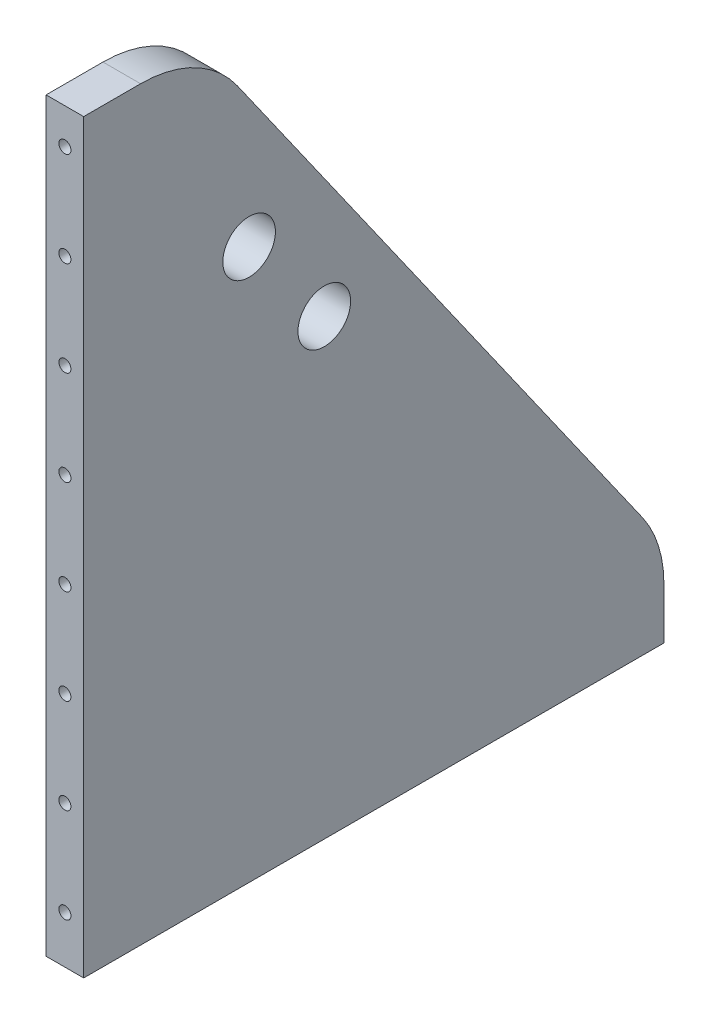
ISO-10303-21;
HEADER;
FILE_DESCRIPTION(('STEP AP214'),'2;1');
FILE_NAME('part.step','',(''),(''),'','','');
FILE_SCHEMA(('AUTOMOTIVE_DESIGN { 1 0 10303 214 1 1 1 1 }'));
ENDSEC;
DATA;
#1=APPLICATION_CONTEXT('core data for automotive mechanical design processes');
#2=APPLICATION_PROTOCOL_DEFINITION('international standard','automotive_design',2000,#1);
#3=PRODUCT_CONTEXT('',#1,'mechanical');
#4=PRODUCT('Part','Part','',(#3));
#5=PRODUCT_RELATED_PRODUCT_CATEGORY('part','',(#4));
#6=PRODUCT_DEFINITION_FORMATION('','',#4);
#7=PRODUCT_DEFINITION_CONTEXT('part definition',#1,'design');
#8=PRODUCT_DEFINITION('design','',#6,#7);
#9=PRODUCT_DEFINITION_SHAPE('','',#8);
#10=(LENGTH_UNIT() NAMED_UNIT(*) SI_UNIT(.MILLI.,.METRE.));
#11=(NAMED_UNIT(*) PLANE_ANGLE_UNIT() SI_UNIT($,.RADIAN.));
#12=(NAMED_UNIT(*) SI_UNIT($,.STERADIAN.) SOLID_ANGLE_UNIT());
#13=UNCERTAINTY_MEASURE_WITH_UNIT(LENGTH_MEASURE(1.E-05),#10,'distance_accuracy_value','');
#14=(GEOMETRIC_REPRESENTATION_CONTEXT(3) GLOBAL_UNCERTAINTY_ASSIGNED_CONTEXT((#13)) GLOBAL_UNIT_ASSIGNED_CONTEXT((#10,
#11,#12)) REPRESENTATION_CONTEXT('',''));
#15=CARTESIAN_POINT('',(0.,0.,0.));
#16=DIRECTION('',(0.,0.,1.));
#17=DIRECTION('',(1.,0.,0.));
#18=AXIS2_PLACEMENT_3D('',#15,#16,#17);
#19=CARTESIAN_POINT('',(31.75,53.3781683908458,-500.));
#20=DIRECTION('',(0.,0.,1.));
#21=DIRECTION('',(1.,0.,0.));
#22=AXIS2_PLACEMENT_3D('',#19,#20,#21);
#23=PLANE('',#22);
#24=DIRECTION('',(0.,1.,0.));
#25=VECTOR('',#24,1.);
#26=CARTESIAN_POINT('',(31.75,53.3781683908458,-500.));
#27=LINE('',#26,#25);
#28=CARTESIAN_POINT('',(31.75,9.99999999999994,-500.));
#29=VERTEX_POINT('',#28);
#30=CARTESIAN_POINT('',(31.75,53.3781683908458,-500.));
#31=VERTEX_POINT('',#30);
#32=EDGE_CURVE('E185',#29,#31,#27,.T.);
#33=ORIENTED_EDGE('',*,*,#32,.F.);
#34=DIRECTION('',(-1.,0.,0.));
#35=VECTOR('',#34,1.);
#36=CARTESIAN_POINT('',(31.75,9.99999999999994,-500.));
#37=LINE('',#36,#35);
#38=CARTESIAN_POINT('',(0.,9.99999999999994,-500.));
#39=VERTEX_POINT('',#38);
#40=EDGE_CURVE('E178',#29,#39,#37,.T.);
#41=ORIENTED_EDGE('',*,*,#40,.T.);
#42=DIRECTION('',(0.,1.,0.));
#43=VECTOR('',#42,1.);
#44=CARTESIAN_POINT('',(0.,53.3781683908458,-500.));
#45=LINE('',#44,#43);
#46=CARTESIAN_POINT('',(0.,53.3781683908458,-500.));
#47=VERTEX_POINT('',#46);
#48=EDGE_CURVE('E181',#39,#47,#45,.T.);
#49=ORIENTED_EDGE('',*,*,#48,.T.);
#50=DIRECTION('',(-1.,0.,0.));
#51=VECTOR('',#50,1.);
#52=CARTESIAN_POINT('',(31.75,53.3781683908458,-500.));
#53=LINE('',#52,#51);
#54=EDGE_CURVE('E215',#31,#47,#53,.T.);
#55=ORIENTED_EDGE('',*,*,#54,.F.);
#56=EDGE_LOOP('',(#33,#41,#49,#55));
#57=FACE_BOUND('',#56,.T.);
#58=ADVANCED_FACE('F38',(#57),#23,.F.);
#59=CARTESIAN_POINT('',(31.75,53.3781683908458,-400.));
#60=DIRECTION('',(-1.,0.,0.));
#61=DIRECTION('',(0.,0.,1.));
#62=AXIS2_PLACEMENT_3D('',#59,#60,#61);
#63=CYLINDRICAL_SURFACE('',#62,100.);
#64=CARTESIAN_POINT('',(0.,53.3781683908458,-400.));
#65=DIRECTION('',(1.,0.,0.));
#66=DIRECTION('',(0.,0.,1.));
#67=AXIS2_PLACEMENT_3D('',#64,#65,#66);
#68=CIRCLE('',#67,100.);
#69=CARTESIAN_POINT('',(0.,110.872720062136,-481.819169686067));
#70=VERTEX_POINT('',#69);
#71=EDGE_CURVE('E199',#47,#70,#68,.T.);
#72=ORIENTED_EDGE('',*,*,#71,.T.);
#73=DIRECTION('',(-1.,0.,0.));
#74=VECTOR('',#73,1.);
#75=CARTESIAN_POINT('',(31.75,110.872720062136,-481.819169686067));
#76=LINE('',#75,#74);
#77=CARTESIAN_POINT('',(31.75,110.872720062136,-481.819169686067));
#78=VERTEX_POINT('',#77);
#79=EDGE_CURVE('E212',#78,#70,#76,.T.);
#80=ORIENTED_EDGE('',*,*,#79,.F.);
#81=CARTESIAN_POINT('',(31.75,53.3781683908458,-400.));
#82=DIRECTION('',(1.,0.,0.));
#83=DIRECTION('',(0.,0.,1.));
#84=AXIS2_PLACEMENT_3D('',#81,#82,#83);
#85=CIRCLE('',#84,100.);
#86=EDGE_CURVE('E187',#31,#78,#85,.T.);
#87=ORIENTED_EDGE('',*,*,#86,.F.);
#88=ORIENTED_EDGE('',*,*,#54,.T.);
#89=EDGE_LOOP('',(#72,#80,#87,#88));
#90=FACE_BOUND('',#89,.T.);
#91=ADVANCED_FACE('F295',(#90),#63,.T.);
#92=CARTESIAN_POINT('',(31.75,597.49455167129,-139.868693420175));
#93=DIRECTION('',(0.,-0.5749455167129,0.818191696860666));
#94=DIRECTION('',(0.,-0.818191696860666,-0.5749455167129));
#95=AXIS2_PLACEMENT_3D('',#92,#93,#94);
#96=PLANE('',#95);
#97=DIRECTION('',(0.,0.818191696860666,0.5749455167129));
#98=VECTOR('',#97,1.);
#99=CARTESIAN_POINT('',(0.,597.49455167129,-139.868693420175));
#100=LINE('',#99,#98);
#101=CARTESIAN_POINT('',(0.,597.49455167129,-139.868693420175));
#102=VERTEX_POINT('',#101);
#103=EDGE_CURVE('E201',#70,#102,#100,.T.);
#104=ORIENTED_EDGE('',*,*,#103,.T.);
#105=DIRECTION('',(-1.,0.,0.));
#106=VECTOR('',#105,1.);
#107=CARTESIAN_POINT('',(31.75,597.49455167129,-139.868693420175));
#108=LINE('',#107,#106);
#109=CARTESIAN_POINT('',(31.75,597.49455167129,-139.868693420175));
#110=VERTEX_POINT('',#109);
#111=EDGE_CURVE('E209',#110,#102,#108,.T.);
#112=ORIENTED_EDGE('',*,*,#111,.F.);
#113=DIRECTION('',(0.,0.818191696860666,0.5749455167129));
#114=VECTOR('',#113,1.);
#115=CARTESIAN_POINT('',(31.75,597.49455167129,-139.868693420175));
#116=LINE('',#115,#114);
#117=EDGE_CURVE('E190',#78,#110,#116,.T.);
#118=ORIENTED_EDGE('',*,*,#117,.F.);
#119=ORIENTED_EDGE('',*,*,#79,.T.);
#120=EDGE_LOOP('',(#104,#112,#118,#119));
#121=FACE_BOUND('',#120,.T.);
#122=ADVANCED_FACE('F301',(#121),#96,.F.);
#123=CARTESIAN_POINT('',(31.75,540.,-58.049523734108));
#124=DIRECTION('',(-1.,0.,0.));
#125=DIRECTION('',(0.,0.,1.));
#126=AXIS2_PLACEMENT_3D('',#123,#124,#125);
#127=CYLINDRICAL_SURFACE('',#126,99.9999999999999);
#128=CARTESIAN_POINT('',(0.,540.,-58.049523734108));
#129=DIRECTION('',(1.,0.,0.));
#130=DIRECTION('',(0.,0.,1.));
#131=AXIS2_PLACEMENT_3D('',#128,#129,#130);
#132=CIRCLE('',#131,99.9999999999999);
#133=CARTESIAN_POINT('',(0.,640.,-58.049523734108));
#134=VERTEX_POINT('',#133);
#135=EDGE_CURVE('E203',#102,#134,#132,.T.);
#136=ORIENTED_EDGE('',*,*,#135,.T.);
#137=DIRECTION('',(-1.,0.,0.));
#138=VECTOR('',#137,1.);
#139=CARTESIAN_POINT('',(31.75,640.,-58.049523734108));
#140=LINE('',#139,#138);
#141=CARTESIAN_POINT('',(31.75,640.,-58.049523734108));
#142=VERTEX_POINT('',#141);
#143=EDGE_CURVE('E197',#142,#134,#140,.T.);
#144=ORIENTED_EDGE('',*,*,#143,.F.);
#145=CARTESIAN_POINT('',(31.75,540.,-58.049523734108));
#146=DIRECTION('',(1.,0.,0.));
#147=DIRECTION('',(0.,0.,1.));
#148=AXIS2_PLACEMENT_3D('',#145,#146,#147);
#149=CIRCLE('',#148,99.9999999999999);
#150=EDGE_CURVE('E192',#110,#142,#149,.T.);
#151=ORIENTED_EDGE('',*,*,#150,.F.);
#152=ORIENTED_EDGE('',*,*,#111,.T.);
#153=EDGE_LOOP('',(#136,#144,#151,#152));
#154=FACE_BOUND('',#153,.T.);
#155=ADVANCED_FACE('F659',(#154),#127,.T.);
#156=CARTESIAN_POINT('',(31.75,640.,0.));
#157=DIRECTION('',(0.,-1.,0.));
#158=DIRECTION('',(0.,0.,-1.));
#159=AXIS2_PLACEMENT_3D('',#156,#157,#158);
#160=PLANE('',#159);
#161=DIRECTION('',(0.,0.,1.));
#162=VECTOR('',#161,1.);
#163=CARTESIAN_POINT('',(0.,640.,0.));
#164=LINE('',#163,#162);
#165=CARTESIAN_POINT('',(0.,640.,-10.));
#166=VERTEX_POINT('',#165);
#167=EDGE_CURVE('E188',#134,#166,#164,.T.);
#168=ORIENTED_EDGE('',*,*,#167,.T.);
#169=DIRECTION('',(-1.,0.,0.));
#170=VECTOR('',#169,1.);
#171=CARTESIAN_POINT('',(31.75,640.,-10.));
#172=LINE('',#171,#170);
#173=CARTESIAN_POINT('',(31.75,640.,-10.));
#174=VERTEX_POINT('',#173);
#175=EDGE_CURVE('E174',#174,#166,#172,.T.);
#176=ORIENTED_EDGE('',*,*,#175,.F.);
#177=DIRECTION('',(0.,0.,1.));
#178=VECTOR('',#177,1.);
#179=CARTESIAN_POINT('',(31.75,640.,0.));
#180=LINE('',#179,#178);
#181=EDGE_CURVE('E194',#142,#174,#180,.T.);
#182=ORIENTED_EDGE('',*,*,#181,.F.);
#183=ORIENTED_EDGE('',*,*,#143,.T.);
#184=EDGE_LOOP('',(#168,#176,#182,#183));
#185=FACE_BOUND('',#184,.T.);
#186=ADVANCED_FACE('F654',(#185),#160,.F.);
#187=CARTESIAN_POINT('',(31.75,540.,-58.049523734108));
#188=DIRECTION('',(-1.,0.,0.));
#189=DIRECTION('',(0.,0.,1.));
#190=AXIS2_PLACEMENT_3D('',#187,#188,#189);
#191=PLANE('',#190);
#192=CARTESIAN_POINT('',(31.75,474.9,-149.7));
#193=DIRECTION('',(-1.,0.,0.));
#194=DIRECTION('',(0.,0.,1.));
#195=AXIS2_PLACEMENT_3D('',#192,#193,#194);
#196=CIRCLE('',#195,22.225);
#197=CARTESIAN_POINT('',(31.75,474.9,-127.475));
#198=VERTEX_POINT('',#197);
#199=EDGE_CURVE('E623',#198,#198,#196,.T.);
#200=ORIENTED_EDGE('',*,*,#199,.T.);
#201=EDGE_LOOP('',(#200));
#202=FACE_BOUND('',#201,.T.);
#203=CARTESIAN_POINT('',(31.75,392.35,-213.2));
#204=DIRECTION('',(-1.,0.,0.));
#205=DIRECTION('',(0.,0.,1.));
#206=AXIS2_PLACEMENT_3D('',#203,#204,#205);
#207=CIRCLE('',#206,22.225);
#208=CARTESIAN_POINT('',(31.75,392.35,-190.975));
#209=VERTEX_POINT('',#208);
#210=EDGE_CURVE('E148',#209,#209,#207,.T.);
#211=ORIENTED_EDGE('',*,*,#210,.T.);
#212=EDGE_LOOP('',(#211));
#213=FACE_BOUND('',#212,.T.);
#214=DIRECTION('',(0.,-1.,0.));
#215=VECTOR('',#214,1.);
#216=CARTESIAN_POINT('',(31.75,640.,-10.));
#217=LINE('',#216,#215);
#218=CARTESIAN_POINT('',(31.75,10.,-9.99999999999993));
#219=VERTEX_POINT('',#218);
#220=EDGE_CURVE('E167',#174,#219,#217,.T.);
#221=ORIENTED_EDGE('',*,*,#220,.T.);
#222=DIRECTION('',(0.,0.,-1.));
#223=VECTOR('',#222,1.);
#224=CARTESIAN_POINT('',(31.75,10.,-9.99999999999993));
#225=LINE('',#224,#223);
#226=EDGE_CURVE('E170',#219,#29,#225,.T.);
#227=ORIENTED_EDGE('',*,*,#226,.T.);
#228=ORIENTED_EDGE('',*,*,#32,.T.);
#229=ORIENTED_EDGE('',*,*,#86,.T.);
#230=ORIENTED_EDGE('',*,*,#117,.T.);
#231=ORIENTED_EDGE('',*,*,#150,.T.);
#232=ORIENTED_EDGE('',*,*,#181,.T.);
#233=EDGE_LOOP('',(#221,#227,#228,#229,#230,#231,#232));
#234=FACE_BOUND('',#233,.T.);
#235=ADVANCED_FACE('F288',(#202,#213,#234),#191,.F.);
#236=CARTESIAN_POINT('',(0.,540.,-58.049523734108));
#237=DIRECTION('',(-1.,0.,0.));
#238=DIRECTION('',(0.,0.,1.));
#239=AXIS2_PLACEMENT_3D('',#236,#237,#238);
#240=PLANE('',#239);
#241=CARTESIAN_POINT('',(0.,474.9,-149.7));
#242=DIRECTION('',(-1.,0.,0.));
#243=DIRECTION('',(0.,0.,1.));
#244=AXIS2_PLACEMENT_3D('',#241,#242,#243);
#245=CIRCLE('',#244,22.225);
#246=CARTESIAN_POINT('',(0.,474.9,-127.475));
#247=VERTEX_POINT('',#246);
#248=EDGE_CURVE('E626',#247,#247,#245,.T.);
#249=ORIENTED_EDGE('',*,*,#248,.F.);
#250=EDGE_LOOP('',(#249));
#251=FACE_BOUND('',#250,.T.);
#252=CARTESIAN_POINT('',(0.,392.35,-213.2));
#253=DIRECTION('',(-1.,0.,0.));
#254=DIRECTION('',(0.,0.,1.));
#255=AXIS2_PLACEMENT_3D('',#252,#253,#254);
#256=CIRCLE('',#255,22.225);
#257=CARTESIAN_POINT('',(0.,392.35,-190.975));
#258=VERTEX_POINT('',#257);
#259=EDGE_CURVE('E628',#258,#258,#256,.T.);
#260=ORIENTED_EDGE('',*,*,#259,.F.);
#261=EDGE_LOOP('',(#260));
#262=FACE_BOUND('',#261,.T.);
#263=DIRECTION('',(0.,0.,-1.));
#264=VECTOR('',#263,1.);
#265=CARTESIAN_POINT('',(0.,10.,-9.99999999999993));
#266=LINE('',#265,#264);
#267=CARTESIAN_POINT('',(0.,10.,-9.99999999999993));
#268=VERTEX_POINT('',#267);
#269=EDGE_CURVE('E171',#268,#39,#266,.T.);
#270=ORIENTED_EDGE('',*,*,#269,.F.);
#271=DIRECTION('',(0.,-1.,0.));
#272=VECTOR('',#271,1.);
#273=CARTESIAN_POINT('',(0.,640.,-10.));
#274=LINE('',#273,#272);
#275=EDGE_CURVE('E166',#166,#268,#274,.T.);
#276=ORIENTED_EDGE('',*,*,#275,.F.);
#277=ORIENTED_EDGE('',*,*,#167,.F.);
#278=ORIENTED_EDGE('',*,*,#135,.F.);
#279=ORIENTED_EDGE('',*,*,#103,.F.);
#280=ORIENTED_EDGE('',*,*,#71,.F.);
#281=ORIENTED_EDGE('',*,*,#48,.F.);
#282=EDGE_LOOP('',(#270,#276,#277,#278,#279,#280,#281));
#283=FACE_BOUND('',#282,.T.);
#284=ADVANCED_FACE('F278',(#251,#262,#283),#240,.T.);
#285=CARTESIAN_POINT('',(31.75,10.,-9.99999999999993));
#286=DIRECTION('',(0.,1.,0.));
#287=DIRECTION('',(0.,0.,1.));
#288=AXIS2_PLACEMENT_3D('',#285,#286,#287);
#289=PLANE('',#288);
#290=CARTESIAN_POINT('',(15.875,9.99999999999998,-150.));
#291=DIRECTION('',(0.,-1.,0.));
#292=DIRECTION('',(0.,0.,-1.));
#293=AXIS2_PLACEMENT_3D('',#290,#291,#292);
#294=CIRCLE('',#293,5.09999999999999);
#295=CARTESIAN_POINT('',(15.875,9.99999999999998,-155.1));
#296=VERTEX_POINT('',#295);
#297=EDGE_CURVE('E142',#296,#296,#294,.T.);
#298=ORIENTED_EDGE('',*,*,#297,.F.);
#299=EDGE_LOOP('',(#298));
#300=FACE_BOUND('',#299,.T.);
#301=CARTESIAN_POINT('',(15.875,9.99999999999999,-69.9999999999999));
#302=DIRECTION('',(0.,-1.,0.));
#303=DIRECTION('',(0.,0.,-1.));
#304=AXIS2_PLACEMENT_3D('',#301,#302,#303);
#305=CIRCLE('',#304,5.09999999999999);
#306=CARTESIAN_POINT('',(15.875,9.99999999999999,-75.0999999999999));
#307=VERTEX_POINT('',#306);
#308=EDGE_CURVE('E141',#307,#307,#305,.T.);
#309=ORIENTED_EDGE('',*,*,#308,.F.);
#310=EDGE_LOOP('',(#309));
#311=FACE_BOUND('',#310,.T.);
#312=ORIENTED_EDGE('',*,*,#269,.T.);
#313=ORIENTED_EDGE('',*,*,#40,.F.);
#314=ORIENTED_EDGE('',*,*,#226,.F.);
#315=DIRECTION('',(-1.,0.,0.));
#316=VECTOR('',#315,1.);
#317=CARTESIAN_POINT('',(31.75,10.,-9.99999999999993));
#318=LINE('',#317,#316);
#319=EDGE_CURVE('E182',#219,#268,#318,.T.);
#320=ORIENTED_EDGE('',*,*,#319,.T.);
#321=EDGE_LOOP('',(#312,#313,#314,#320));
#322=FACE_BOUND('',#321,.T.);
#323=CARTESIAN_POINT('',(15.875,9.99999999999997,-230.));
#324=DIRECTION('',(0.,-1.,0.));
#325=DIRECTION('',(0.,0.,-1.));
#326=AXIS2_PLACEMENT_3D('',#323,#324,#325);
#327=CIRCLE('',#326,5.09999999999999);
#328=CARTESIAN_POINT('',(15.875,9.99999999999997,-235.1));
#329=VERTEX_POINT('',#328);
#330=EDGE_CURVE('E254',#329,#329,#327,.T.);
#331=ORIENTED_EDGE('',*,*,#330,.F.);
#332=EDGE_LOOP('',(#331));
#333=FACE_BOUND('',#332,.T.);
#334=CARTESIAN_POINT('',(15.875,9.99999999999996,-310.));
#335=DIRECTION('',(0.,-1.,0.));
#336=DIRECTION('',(0.,0.,-1.));
#337=AXIS2_PLACEMENT_3D('',#334,#335,#336);
#338=CIRCLE('',#337,5.09999999999999);
#339=CARTESIAN_POINT('',(15.875,9.99999999999996,-315.1));
#340=VERTEX_POINT('',#339);
#341=EDGE_CURVE('E260',#340,#340,#338,.T.);
#342=ORIENTED_EDGE('',*,*,#341,.F.);
#343=EDGE_LOOP('',(#342));
#344=FACE_BOUND('',#343,.T.);
#345=CARTESIAN_POINT('',(15.875,9.99999999999995,-390.));
#346=DIRECTION('',(0.,-1.,0.));
#347=DIRECTION('',(0.,0.,-1.));
#348=AXIS2_PLACEMENT_3D('',#345,#346,#347);
#349=CIRCLE('',#348,5.09999999999999);
#350=CARTESIAN_POINT('',(15.875,9.99999999999995,-395.1));
#351=VERTEX_POINT('',#350);
#352=EDGE_CURVE('E266',#351,#351,#349,.T.);
#353=ORIENTED_EDGE('',*,*,#352,.F.);
#354=EDGE_LOOP('',(#353));
#355=FACE_BOUND('',#354,.T.);
#356=CARTESIAN_POINT('',(15.875,9.99999999999994,-470.));
#357=DIRECTION('',(0.,-1.,0.));
#358=DIRECTION('',(0.,0.,-1.));
#359=AXIS2_PLACEMENT_3D('',#356,#357,#358);
#360=CIRCLE('',#359,5.09999999999999);
#361=CARTESIAN_POINT('',(15.875,9.99999999999994,-475.1));
#362=VERTEX_POINT('',#361);
#363=EDGE_CURVE('E46',#362,#362,#360,.T.);
#364=ORIENTED_EDGE('',*,*,#363,.F.);
#365=EDGE_LOOP('',(#364));
#366=FACE_BOUND('',#365,.T.);
#367=ADVANCED_FACE('F275',(#300,#311,#322,#333,#344,#355,#366),#289,.F.);
#368=CARTESIAN_POINT('',(31.75,640.,-10.));
#369=DIRECTION('',(0.,0.,-1.));
#370=DIRECTION('',(0.,1.,0.));
#371=AXIS2_PLACEMENT_3D('',#368,#369,#370);
#372=PLANE('',#371);
#373=CARTESIAN_POINT('',(15.875,130.,-9.99999999999994));
#374=DIRECTION('',(0.,0.,1.));
#375=DIRECTION('',(1.,0.,0.));
#376=AXIS2_PLACEMENT_3D('',#373,#374,#375);
#377=CIRCLE('',#376,5.09999999999999);
#378=CARTESIAN_POINT('',(20.975,130.,-9.99999999999994));
#379=VERTEX_POINT('',#378);
#380=EDGE_CURVE('E154',#379,#379,#377,.T.);
#381=ORIENTED_EDGE('',*,*,#380,.F.);
#382=EDGE_LOOP('',(#381));
#383=FACE_BOUND('',#382,.T.);
#384=CARTESIAN_POINT('',(15.875,50.,-9.99999999999993));
#385=DIRECTION('',(0.,0.,1.));
#386=DIRECTION('',(1.,0.,0.));
#387=AXIS2_PLACEMENT_3D('',#384,#385,#386);
#388=CIRCLE('',#387,5.09999999999999);
#389=CARTESIAN_POINT('',(20.975,50.,-9.99999999999993));
#390=VERTEX_POINT('',#389);
#391=EDGE_CURVE('E160',#390,#390,#388,.T.);
#392=ORIENTED_EDGE('',*,*,#391,.F.);
#393=EDGE_LOOP('',(#392));
#394=FACE_BOUND('',#393,.T.);
#395=ORIENTED_EDGE('',*,*,#275,.T.);
#396=ORIENTED_EDGE('',*,*,#319,.F.);
#397=ORIENTED_EDGE('',*,*,#220,.F.);
#398=ORIENTED_EDGE('',*,*,#175,.T.);
#399=EDGE_LOOP('',(#395,#396,#397,#398));
#400=FACE_BOUND('',#399,.T.);
#401=CARTESIAN_POINT('',(15.875,210.,-9.99999999999995));
#402=DIRECTION('',(0.,0.,1.));
#403=DIRECTION('',(1.,0.,0.));
#404=AXIS2_PLACEMENT_3D('',#401,#402,#403);
#405=CIRCLE('',#404,5.09999999999999);
#406=CARTESIAN_POINT('',(20.975,210.,-9.99999999999995));
#407=VERTEX_POINT('',#406);
#408=EDGE_CURVE('E218',#407,#407,#405,.T.);
#409=ORIENTED_EDGE('',*,*,#408,.F.);
#410=EDGE_LOOP('',(#409));
#411=FACE_BOUND('',#410,.T.);
#412=CARTESIAN_POINT('',(15.875,290.,-9.99999999999996));
#413=DIRECTION('',(0.,0.,1.));
#414=DIRECTION('',(1.,0.,0.));
#415=AXIS2_PLACEMENT_3D('',#412,#413,#414);
#416=CIRCLE('',#415,5.09999999999999);
#417=CARTESIAN_POINT('',(20.975,290.,-9.99999999999996));
#418=VERTEX_POINT('',#417);
#419=EDGE_CURVE('E224',#418,#418,#416,.T.);
#420=ORIENTED_EDGE('',*,*,#419,.F.);
#421=EDGE_LOOP('',(#420));
#422=FACE_BOUND('',#421,.T.);
#423=CARTESIAN_POINT('',(15.875,370.,-9.99999999999997));
#424=DIRECTION('',(0.,0.,1.));
#425=DIRECTION('',(1.,0.,0.));
#426=AXIS2_PLACEMENT_3D('',#423,#424,#425);
#427=CIRCLE('',#426,5.09999999999999);
#428=CARTESIAN_POINT('',(20.975,370.,-9.99999999999997));
#429=VERTEX_POINT('',#428);
#430=EDGE_CURVE('E230',#429,#429,#427,.T.);
#431=ORIENTED_EDGE('',*,*,#430,.F.);
#432=EDGE_LOOP('',(#431));
#433=FACE_BOUND('',#432,.T.);
#434=CARTESIAN_POINT('',(15.875,450.,-9.99999999999998));
#435=DIRECTION('',(0.,0.,1.));
#436=DIRECTION('',(1.,0.,0.));
#437=AXIS2_PLACEMENT_3D('',#434,#435,#436);
#438=CIRCLE('',#437,5.09999999999999);
#439=CARTESIAN_POINT('',(20.975,450.,-9.99999999999998));
#440=VERTEX_POINT('',#439);
#441=EDGE_CURVE('E236',#440,#440,#438,.T.);
#442=ORIENTED_EDGE('',*,*,#441,.F.);
#443=EDGE_LOOP('',(#442));
#444=FACE_BOUND('',#443,.T.);
#445=CARTESIAN_POINT('',(15.875,530.,-9.99999999999999));
#446=DIRECTION('',(0.,0.,1.));
#447=DIRECTION('',(1.,0.,0.));
#448=AXIS2_PLACEMENT_3D('',#445,#446,#447);
#449=CIRCLE('',#448,5.09999999999999);
#450=CARTESIAN_POINT('',(20.975,530.,-9.99999999999999));
#451=VERTEX_POINT('',#450);
#452=EDGE_CURVE('E242',#451,#451,#449,.T.);
#453=ORIENTED_EDGE('',*,*,#452,.F.);
#454=EDGE_LOOP('',(#453));
#455=FACE_BOUND('',#454,.T.);
#456=CARTESIAN_POINT('',(15.875,610.,-10.));
#457=DIRECTION('',(0.,0.,1.));
#458=DIRECTION('',(1.,0.,0.));
#459=AXIS2_PLACEMENT_3D('',#456,#457,#458);
#460=CIRCLE('',#459,5.09999999999999);
#461=CARTESIAN_POINT('',(20.975,610.,-10.));
#462=VERTEX_POINT('',#461);
#463=EDGE_CURVE('E248',#462,#462,#460,.T.);
#464=ORIENTED_EDGE('',*,*,#463,.F.);
#465=EDGE_LOOP('',(#464));
#466=FACE_BOUND('',#465,.T.);
#467=ADVANCED_FACE('F277',(#383,#394,#400,#411,#422,#433,#444,#455,#466),#372,.F.);
#468=CARTESIAN_POINT('',(15.875,50.,-53.9899999999999));
#469=DIRECTION('',(0.,0.,1.));
#470=DIRECTION('',(1.,0.,0.));
#471=AXIS2_PLACEMENT_3D('',#468,#469,#470);
#472=CONICAL_SURFACE('',#471,5.09999999999999,1.02974425867665);
#473=CARTESIAN_POINT('',(15.875,50.,-57.0543891570405));
#474=VERTEX_POINT('',#473);
#475=VERTEX_LOOP('',#474);
#476=FACE_BOUND('',#475,.T.);
#477=CARTESIAN_POINT('',(15.875,50.,-53.9899999999999));
#478=DIRECTION('',(0.,0.,1.));
#479=DIRECTION('',(1.,0.,0.));
#480=AXIS2_PLACEMENT_3D('',#477,#478,#479);
#481=CIRCLE('',#480,5.09999999999999);
#482=CARTESIAN_POINT('',(20.975,50.,-53.9899999999999));
#483=VERTEX_POINT('',#482);
#484=EDGE_CURVE('E163',#483,#483,#481,.T.);
#485=ORIENTED_EDGE('',*,*,#484,.T.);
#486=EDGE_LOOP('',(#485));
#487=FACE_BOUND('',#486,.T.);
#488=ADVANCED_FACE('F285',(#476,#487),#472,.F.);
#489=CARTESIAN_POINT('',(15.875,50.,-9.99999999999993));
#490=DIRECTION('',(0.,0.,1.));
#491=DIRECTION('',(1.,0.,0.));
#492=AXIS2_PLACEMENT_3D('',#489,#490,#491);
#493=CYLINDRICAL_SURFACE('',#492,5.09999999999999);
#494=ORIENTED_EDGE('',*,*,#484,.F.);
#495=EDGE_LOOP('',(#494));
#496=FACE_BOUND('',#495,.T.);
#497=ORIENTED_EDGE('',*,*,#391,.T.);
#498=EDGE_LOOP('',(#497));
#499=FACE_BOUND('',#498,.T.);
#500=ADVANCED_FACE('F517',(#496,#499),#493,.F.);
#501=CARTESIAN_POINT('',(15.875,130.,-53.9899999999999));
#502=DIRECTION('',(0.,0.,1.));
#503=DIRECTION('',(1.,0.,0.));
#504=AXIS2_PLACEMENT_3D('',#501,#502,#503);
#505=CONICAL_SURFACE('',#504,5.09999999999999,1.02974425867665);
#506=CARTESIAN_POINT('',(15.875,130.,-57.0543891570405));
#507=VERTEX_POINT('',#506);
#508=VERTEX_LOOP('',#507);
#509=FACE_BOUND('',#508,.T.);
#510=CARTESIAN_POINT('',(15.875,130.,-53.9899999999999));
#511=DIRECTION('',(0.,0.,1.));
#512=DIRECTION('',(1.,0.,0.));
#513=AXIS2_PLACEMENT_3D('',#510,#511,#512);
#514=CIRCLE('',#513,5.09999999999999);
#515=CARTESIAN_POINT('',(20.975,130.,-53.9899999999999));
#516=VERTEX_POINT('',#515);
#517=EDGE_CURVE('E157',#516,#516,#514,.T.);
#518=ORIENTED_EDGE('',*,*,#517,.T.);
#519=EDGE_LOOP('',(#518));
#520=FACE_BOUND('',#519,.T.);
#521=ADVANCED_FACE('F509',(#509,#520),#505,.F.);
#522=CARTESIAN_POINT('',(15.875,130.,-9.99999999999994));
#523=DIRECTION('',(0.,0.,1.));
#524=DIRECTION('',(1.,0.,0.));
#525=AXIS2_PLACEMENT_3D('',#522,#523,#524);
#526=CYLINDRICAL_SURFACE('',#525,5.09999999999999);
#527=ORIENTED_EDGE('',*,*,#517,.F.);
#528=EDGE_LOOP('',(#527));
#529=FACE_BOUND('',#528,.T.);
#530=ORIENTED_EDGE('',*,*,#380,.T.);
#531=EDGE_LOOP('',(#530));
#532=FACE_BOUND('',#531,.T.);
#533=ADVANCED_FACE('F315',(#529,#532),#526,.F.);
#534=CARTESIAN_POINT('',(15.875,210.,-9.99999999999995));
#535=DIRECTION('',(0.,0.,1.));
#536=DIRECTION('',(1.,0.,0.));
#537=AXIS2_PLACEMENT_3D('',#534,#535,#536);
#538=CYLINDRICAL_SURFACE('',#537,5.09999999999999);
#539=CARTESIAN_POINT('',(15.875,210.,-53.9899999999999));
#540=DIRECTION('',(0.,0.,1.));
#541=DIRECTION('',(1.,0.,0.));
#542=AXIS2_PLACEMENT_3D('',#539,#540,#541);
#543=CIRCLE('',#542,5.09999999999999);
#544=CARTESIAN_POINT('',(20.975,210.,-53.9899999999999));
#545=VERTEX_POINT('',#544);
#546=EDGE_CURVE('E221',#545,#545,#543,.T.);
#547=ORIENTED_EDGE('',*,*,#546,.F.);
#548=EDGE_LOOP('',(#547));
#549=FACE_BOUND('',#548,.T.);
#550=ORIENTED_EDGE('',*,*,#408,.T.);
#551=EDGE_LOOP('',(#550));
#552=FACE_BOUND('',#551,.T.);
#553=ADVANCED_FACE('F311',(#549,#552),#538,.F.);
#554=CARTESIAN_POINT('',(15.875,210.,-53.9899999999999));
#555=DIRECTION('',(0.,0.,1.));
#556=DIRECTION('',(1.,0.,0.));
#557=AXIS2_PLACEMENT_3D('',#554,#555,#556);
#558=CONICAL_SURFACE('',#557,5.09999999999999,1.02974425867665);
#559=CARTESIAN_POINT('',(15.875,210.,-57.0543891570405));
#560=VERTEX_POINT('',#559);
#561=VERTEX_LOOP('',#560);
#562=FACE_BOUND('',#561,.T.);
#563=ORIENTED_EDGE('',*,*,#546,.T.);
#564=EDGE_LOOP('',(#563));
#565=FACE_BOUND('',#564,.T.);
#566=ADVANCED_FACE('F307',(#562,#565),#558,.F.);
#567=CARTESIAN_POINT('',(15.875,290.,-9.99999999999996));
#568=DIRECTION('',(0.,0.,1.));
#569=DIRECTION('',(1.,0.,0.));
#570=AXIS2_PLACEMENT_3D('',#567,#568,#569);
#571=CYLINDRICAL_SURFACE('',#570,5.09999999999999);
#572=CARTESIAN_POINT('',(15.875,290.,-53.99));
#573=DIRECTION('',(0.,0.,1.));
#574=DIRECTION('',(1.,0.,0.));
#575=AXIS2_PLACEMENT_3D('',#572,#573,#574);
#576=CIRCLE('',#575,5.09999999999999);
#577=CARTESIAN_POINT('',(20.975,290.,-53.99));
#578=VERTEX_POINT('',#577);
#579=EDGE_CURVE('E227',#578,#578,#576,.T.);
#580=ORIENTED_EDGE('',*,*,#579,.F.);
#581=EDGE_LOOP('',(#580));
#582=FACE_BOUND('',#581,.T.);
#583=ORIENTED_EDGE('',*,*,#419,.T.);
#584=EDGE_LOOP('',(#583));
#585=FACE_BOUND('',#584,.T.);
#586=ADVANCED_FACE('F310',(#582,#585),#571,.F.);
#587=CARTESIAN_POINT('',(15.875,290.,-53.99));
#588=DIRECTION('',(0.,0.,1.));
#589=DIRECTION('',(1.,0.,0.));
#590=AXIS2_PLACEMENT_3D('',#587,#588,#589);
#591=CONICAL_SURFACE('',#590,5.09999999999999,1.02974425867665);
#592=CARTESIAN_POINT('',(15.875,290.,-57.0543891570405));
#593=VERTEX_POINT('',#592);
#594=VERTEX_LOOP('',#593);
#595=FACE_BOUND('',#594,.T.);
#596=ORIENTED_EDGE('',*,*,#579,.T.);
#597=EDGE_LOOP('',(#596));
#598=FACE_BOUND('',#597,.T.);
#599=ADVANCED_FACE('F317',(#595,#598),#591,.F.);
#600=CARTESIAN_POINT('',(15.875,370.,-9.99999999999997));
#601=DIRECTION('',(0.,0.,1.));
#602=DIRECTION('',(1.,0.,0.));
#603=AXIS2_PLACEMENT_3D('',#600,#601,#602);
#604=CYLINDRICAL_SURFACE('',#603,5.09999999999999);
#605=CARTESIAN_POINT('',(15.875,370.,-53.99));
#606=DIRECTION('',(0.,0.,1.));
#607=DIRECTION('',(1.,0.,0.));
#608=AXIS2_PLACEMENT_3D('',#605,#606,#607);
#609=CIRCLE('',#608,5.09999999999999);
#610=CARTESIAN_POINT('',(20.975,370.,-53.99));
#611=VERTEX_POINT('',#610);
#612=EDGE_CURVE('E233',#611,#611,#609,.T.);
#613=ORIENTED_EDGE('',*,*,#612,.F.);
#614=EDGE_LOOP('',(#613));
#615=FACE_BOUND('',#614,.T.);
#616=ORIENTED_EDGE('',*,*,#430,.T.);
#617=EDGE_LOOP('',(#616));
#618=FACE_BOUND('',#617,.T.);
#619=ADVANCED_FACE('F320',(#615,#618),#604,.F.);
#620=CARTESIAN_POINT('',(15.875,370.,-53.99));
#621=DIRECTION('',(0.,0.,1.));
#622=DIRECTION('',(1.,0.,0.));
#623=AXIS2_PLACEMENT_3D('',#620,#621,#622);
#624=CONICAL_SURFACE('',#623,5.09999999999999,1.02974425867665);
#625=CARTESIAN_POINT('',(15.875,370.,-57.0543891570405));
#626=VERTEX_POINT('',#625);
#627=VERTEX_LOOP('',#626);
#628=FACE_BOUND('',#627,.T.);
#629=ORIENTED_EDGE('',*,*,#612,.T.);
#630=EDGE_LOOP('',(#629));
#631=FACE_BOUND('',#630,.T.);
#632=ADVANCED_FACE('F325',(#628,#631),#624,.F.);
#633=CARTESIAN_POINT('',(15.875,450.,-9.99999999999998));
#634=DIRECTION('',(0.,0.,1.));
#635=DIRECTION('',(1.,0.,0.));
#636=AXIS2_PLACEMENT_3D('',#633,#634,#635);
#637=CYLINDRICAL_SURFACE('',#636,5.09999999999999);
#638=CARTESIAN_POINT('',(15.875,450.,-53.99));
#639=DIRECTION('',(0.,0.,1.));
#640=DIRECTION('',(1.,0.,0.));
#641=AXIS2_PLACEMENT_3D('',#638,#639,#640);
#642=CIRCLE('',#641,5.09999999999999);
#643=CARTESIAN_POINT('',(20.975,450.,-53.99));
#644=VERTEX_POINT('',#643);
#645=EDGE_CURVE('E239',#644,#644,#642,.T.);
#646=ORIENTED_EDGE('',*,*,#645,.F.);
#647=EDGE_LOOP('',(#646));
#648=FACE_BOUND('',#647,.T.);
#649=ORIENTED_EDGE('',*,*,#441,.T.);
#650=EDGE_LOOP('',(#649));
#651=FACE_BOUND('',#650,.T.);
#652=ADVANCED_FACE('F328',(#648,#651),#637,.F.);
#653=CARTESIAN_POINT('',(15.875,450.,-53.99));
#654=DIRECTION('',(0.,0.,1.));
#655=DIRECTION('',(1.,0.,0.));
#656=AXIS2_PLACEMENT_3D('',#653,#654,#655);
#657=CONICAL_SURFACE('',#656,5.09999999999999,1.02974425867665);
#658=CARTESIAN_POINT('',(15.875,450.,-57.0543891570405));
#659=VERTEX_POINT('',#658);
#660=VERTEX_LOOP('',#659);
#661=FACE_BOUND('',#660,.T.);
#662=ORIENTED_EDGE('',*,*,#645,.T.);
#663=EDGE_LOOP('',(#662));
#664=FACE_BOUND('',#663,.T.);
#665=ADVANCED_FACE('F333',(#661,#664),#657,.F.);
#666=CARTESIAN_POINT('',(15.875,530.,-9.99999999999999));
#667=DIRECTION('',(0.,0.,1.));
#668=DIRECTION('',(1.,0.,0.));
#669=AXIS2_PLACEMENT_3D('',#666,#667,#668);
#670=CYLINDRICAL_SURFACE('',#669,5.09999999999999);
#671=CARTESIAN_POINT('',(15.875,530.,-53.99));
#672=DIRECTION('',(0.,0.,1.));
#673=DIRECTION('',(1.,0.,0.));
#674=AXIS2_PLACEMENT_3D('',#671,#672,#673);
#675=CIRCLE('',#674,5.09999999999999);
#676=CARTESIAN_POINT('',(20.975,530.,-53.99));
#677=VERTEX_POINT('',#676);
#678=EDGE_CURVE('E245',#677,#677,#675,.T.);
#679=ORIENTED_EDGE('',*,*,#678,.F.);
#680=EDGE_LOOP('',(#679));
#681=FACE_BOUND('',#680,.T.);
#682=ORIENTED_EDGE('',*,*,#452,.T.);
#683=EDGE_LOOP('',(#682));
#684=FACE_BOUND('',#683,.T.);
#685=ADVANCED_FACE('F336',(#681,#684),#670,.F.);
#686=CARTESIAN_POINT('',(15.875,530.,-53.99));
#687=DIRECTION('',(0.,0.,1.));
#688=DIRECTION('',(1.,0.,0.));
#689=AXIS2_PLACEMENT_3D('',#686,#687,#688);
#690=CONICAL_SURFACE('',#689,5.09999999999999,1.02974425867665);
#691=CARTESIAN_POINT('',(15.875,530.,-57.0543891570406));
#692=VERTEX_POINT('',#691);
#693=VERTEX_LOOP('',#692);
#694=FACE_BOUND('',#693,.T.);
#695=ORIENTED_EDGE('',*,*,#678,.T.);
#696=EDGE_LOOP('',(#695));
#697=FACE_BOUND('',#696,.T.);
#698=ADVANCED_FACE('F341',(#694,#697),#690,.F.);
#699=CARTESIAN_POINT('',(15.875,610.,-10.));
#700=DIRECTION('',(0.,0.,1.));
#701=DIRECTION('',(1.,0.,0.));
#702=AXIS2_PLACEMENT_3D('',#699,#700,#701);
#703=CYLINDRICAL_SURFACE('',#702,5.09999999999999);
#704=CARTESIAN_POINT('',(15.875,610.,-53.99));
#705=DIRECTION('',(0.,0.,1.));
#706=DIRECTION('',(1.,0.,0.));
#707=AXIS2_PLACEMENT_3D('',#704,#705,#706);
#708=CIRCLE('',#707,5.09999999999999);
#709=CARTESIAN_POINT('',(20.975,610.,-53.99));
#710=VERTEX_POINT('',#709);
#711=EDGE_CURVE('E251',#710,#710,#708,.T.);
#712=ORIENTED_EDGE('',*,*,#711,.F.);
#713=EDGE_LOOP('',(#712));
#714=FACE_BOUND('',#713,.T.);
#715=ORIENTED_EDGE('',*,*,#463,.T.);
#716=EDGE_LOOP('',(#715));
#717=FACE_BOUND('',#716,.T.);
#718=ADVANCED_FACE('F344',(#714,#717),#703,.F.);
#719=CARTESIAN_POINT('',(15.875,610.,-53.99));
#720=DIRECTION('',(0.,0.,1.));
#721=DIRECTION('',(1.,0.,0.));
#722=AXIS2_PLACEMENT_3D('',#719,#720,#721);
#723=CONICAL_SURFACE('',#722,5.09999999999999,1.02974425867665);
#724=CARTESIAN_POINT('',(15.875,610.,-57.0543891570406));
#725=VERTEX_POINT('',#724);
#726=VERTEX_LOOP('',#725);
#727=FACE_BOUND('',#726,.T.);
#728=ORIENTED_EDGE('',*,*,#711,.T.);
#729=EDGE_LOOP('',(#728));
#730=FACE_BOUND('',#729,.T.);
#731=ADVANCED_FACE('F349',(#727,#730),#723,.F.);
#732=CARTESIAN_POINT('',(15.875,53.99,-69.9999999999999));
#733=DIRECTION('',(0.,-1.,0.));
#734=DIRECTION('',(0.,0.,-1.));
#735=AXIS2_PLACEMENT_3D('',#732,#733,#734);
#736=CONICAL_SURFACE('',#735,5.09999999999998,1.02974425867665);
#737=CARTESIAN_POINT('',(15.875,57.0543891570406,-69.9999999999999));
#738=VERTEX_POINT('',#737);
#739=VERTEX_LOOP('',#738);
#740=FACE_BOUND('',#739,.T.);
#741=CARTESIAN_POINT('',(15.875,53.99,-69.9999999999999));
#742=DIRECTION('',(0.,-1.,0.));
#743=DIRECTION('',(0.,0.,-1.));
#744=AXIS2_PLACEMENT_3D('',#741,#742,#743);
#745=CIRCLE('',#744,5.09999999999998);
#746=CARTESIAN_POINT('',(15.875,53.99,-75.0999999999999));
#747=VERTEX_POINT('',#746);
#748=EDGE_CURVE('E145',#747,#747,#745,.T.);
#749=ORIENTED_EDGE('',*,*,#748,.T.);
#750=EDGE_LOOP('',(#749));
#751=FACE_BOUND('',#750,.T.);
#752=ADVANCED_FACE('F352',(#740,#751),#736,.F.);
#753=CARTESIAN_POINT('',(15.875,9.99999999999999,-69.9999999999999));
#754=DIRECTION('',(0.,-1.,0.));
#755=DIRECTION('',(0.,0.,-1.));
#756=AXIS2_PLACEMENT_3D('',#753,#754,#755);
#757=CYLINDRICAL_SURFACE('',#756,5.09999999999998);
#758=ORIENTED_EDGE('',*,*,#748,.F.);
#759=EDGE_LOOP('',(#758));
#760=FACE_BOUND('',#759,.T.);
#761=ORIENTED_EDGE('',*,*,#308,.T.);
#762=EDGE_LOOP('',(#761));
#763=FACE_BOUND('',#762,.T.);
#764=ADVANCED_FACE('F135',(#760,#763),#757,.F.);
#765=CARTESIAN_POINT('',(15.875,53.99,-150.));
#766=DIRECTION('',(0.,-1.,0.));
#767=DIRECTION('',(0.,0.,-1.));
#768=AXIS2_PLACEMENT_3D('',#765,#766,#767);
#769=CONICAL_SURFACE('',#768,5.09999999999998,1.02974425867665);
#770=CARTESIAN_POINT('',(15.875,57.0543891570405,-150.));
#771=VERTEX_POINT('',#770);
#772=VERTEX_LOOP('',#771);
#773=FACE_BOUND('',#772,.T.);
#774=CARTESIAN_POINT('',(15.875,53.99,-150.));
#775=DIRECTION('',(0.,-1.,0.));
#776=DIRECTION('',(0.,0.,-1.));
#777=AXIS2_PLACEMENT_3D('',#774,#775,#776);
#778=CIRCLE('',#777,5.09999999999998);
#779=CARTESIAN_POINT('',(15.875,53.99,-155.1));
#780=VERTEX_POINT('',#779);
#781=EDGE_CURVE('E139',#780,#780,#778,.T.);
#782=ORIENTED_EDGE('',*,*,#781,.T.);
#783=EDGE_LOOP('',(#782));
#784=FACE_BOUND('',#783,.T.);
#785=ADVANCED_FACE('F131',(#773,#784),#769,.F.);
#786=CARTESIAN_POINT('',(15.875,9.99999999999998,-150.));
#787=DIRECTION('',(0.,-1.,0.));
#788=DIRECTION('',(0.,0.,-1.));
#789=AXIS2_PLACEMENT_3D('',#786,#787,#788);
#790=CYLINDRICAL_SURFACE('',#789,5.09999999999998);
#791=ORIENTED_EDGE('',*,*,#781,.F.);
#792=EDGE_LOOP('',(#791));
#793=FACE_BOUND('',#792,.T.);
#794=ORIENTED_EDGE('',*,*,#297,.T.);
#795=EDGE_LOOP('',(#794));
#796=FACE_BOUND('',#795,.T.);
#797=ADVANCED_FACE('F134',(#793,#796),#790,.F.);
#798=CARTESIAN_POINT('',(15.875,9.99999999999997,-230.));
#799=DIRECTION('',(0.,-1.,0.));
#800=DIRECTION('',(0.,0.,-1.));
#801=AXIS2_PLACEMENT_3D('',#798,#799,#800);
#802=CYLINDRICAL_SURFACE('',#801,5.09999999999998);
#803=CARTESIAN_POINT('',(15.875,53.99,-230.));
#804=DIRECTION('',(0.,-1.,0.));
#805=DIRECTION('',(0.,0.,-1.));
#806=AXIS2_PLACEMENT_3D('',#803,#804,#805);
#807=CIRCLE('',#806,5.09999999999998);
#808=CARTESIAN_POINT('',(15.875,53.99,-235.1));
#809=VERTEX_POINT('',#808);
#810=EDGE_CURVE('E257',#809,#809,#807,.T.);
#811=ORIENTED_EDGE('',*,*,#810,.F.);
#812=EDGE_LOOP('',(#811));
#813=FACE_BOUND('',#812,.T.);
#814=ORIENTED_EDGE('',*,*,#330,.T.);
#815=EDGE_LOOP('',(#814));
#816=FACE_BOUND('',#815,.T.);
#817=ADVANCED_FACE('F361',(#813,#816),#802,.F.);
#818=CARTESIAN_POINT('',(15.875,53.99,-230.));
#819=DIRECTION('',(0.,-1.,0.));
#820=DIRECTION('',(0.,0.,-1.));
#821=AXIS2_PLACEMENT_3D('',#818,#819,#820);
#822=CONICAL_SURFACE('',#821,5.09999999999998,1.02974425867665);
#823=CARTESIAN_POINT('',(15.875,57.0543891570405,-230.));
#824=VERTEX_POINT('',#823);
#825=VERTEX_LOOP('',#824);
#826=FACE_BOUND('',#825,.T.);
#827=ORIENTED_EDGE('',*,*,#810,.T.);
#828=EDGE_LOOP('',(#827));
#829=FACE_BOUND('',#828,.T.);
#830=ADVANCED_FACE('F357',(#826,#829),#822,.F.);
#831=CARTESIAN_POINT('',(15.875,9.99999999999996,-310.));
#832=DIRECTION('',(0.,-1.,0.));
#833=DIRECTION('',(0.,0.,-1.));
#834=AXIS2_PLACEMENT_3D('',#831,#832,#833);
#835=CYLINDRICAL_SURFACE('',#834,5.09999999999998);
#836=CARTESIAN_POINT('',(15.875,53.99,-310.));
#837=DIRECTION('',(0.,-1.,0.));
#838=DIRECTION('',(0.,0.,-1.));
#839=AXIS2_PLACEMENT_3D('',#836,#837,#838);
#840=CIRCLE('',#839,5.09999999999998);
#841=CARTESIAN_POINT('',(15.875,53.99,-315.1));
#842=VERTEX_POINT('',#841);
#843=EDGE_CURVE('E263',#842,#842,#840,.T.);
#844=ORIENTED_EDGE('',*,*,#843,.F.);
#845=EDGE_LOOP('',(#844));
#846=FACE_BOUND('',#845,.T.);
#847=ORIENTED_EDGE('',*,*,#341,.T.);
#848=EDGE_LOOP('',(#847));
#849=FACE_BOUND('',#848,.T.);
#850=ADVANCED_FACE('F360',(#846,#849),#835,.F.);
#851=CARTESIAN_POINT('',(15.875,53.99,-310.));
#852=DIRECTION('',(0.,-1.,0.));
#853=DIRECTION('',(0.,0.,-1.));
#854=AXIS2_PLACEMENT_3D('',#851,#852,#853);
#855=CONICAL_SURFACE('',#854,5.09999999999998,1.02974425867665);
#856=CARTESIAN_POINT('',(15.875,57.0543891570405,-310.));
#857=VERTEX_POINT('',#856);
#858=VERTEX_LOOP('',#857);
#859=FACE_BOUND('',#858,.T.);
#860=ORIENTED_EDGE('',*,*,#843,.T.);
#861=EDGE_LOOP('',(#860));
#862=FACE_BOUND('',#861,.T.);
#863=ADVANCED_FACE('F366',(#859,#862),#855,.F.);
#864=CARTESIAN_POINT('',(15.875,9.99999999999995,-390.));
#865=DIRECTION('',(0.,-1.,0.));
#866=DIRECTION('',(0.,0.,-1.));
#867=AXIS2_PLACEMENT_3D('',#864,#865,#866);
#868=CYLINDRICAL_SURFACE('',#867,5.09999999999998);
#869=CARTESIAN_POINT('',(15.875,53.99,-390.));
#870=DIRECTION('',(0.,-1.,0.));
#871=DIRECTION('',(0.,0.,-1.));
#872=AXIS2_PLACEMENT_3D('',#869,#870,#871);
#873=CIRCLE('',#872,5.09999999999998);
#874=CARTESIAN_POINT('',(15.875,53.99,-395.1));
#875=VERTEX_POINT('',#874);
#876=EDGE_CURVE('E269',#875,#875,#873,.T.);
#877=ORIENTED_EDGE('',*,*,#876,.F.);
#878=EDGE_LOOP('',(#877));
#879=FACE_BOUND('',#878,.T.);
#880=ORIENTED_EDGE('',*,*,#352,.T.);
#881=EDGE_LOOP('',(#880));
#882=FACE_BOUND('',#881,.T.);
#883=ADVANCED_FACE('F369',(#879,#882),#868,.F.);
#884=CARTESIAN_POINT('',(15.875,53.99,-390.));
#885=DIRECTION('',(0.,-1.,0.));
#886=DIRECTION('',(0.,0.,-1.));
#887=AXIS2_PLACEMENT_3D('',#884,#885,#886);
#888=CONICAL_SURFACE('',#887,5.09999999999998,1.02974425867665);
#889=CARTESIAN_POINT('',(15.875,57.0543891570405,-390.));
#890=VERTEX_POINT('',#889);
#891=VERTEX_LOOP('',#890);
#892=FACE_BOUND('',#891,.T.);
#893=ORIENTED_EDGE('',*,*,#876,.T.);
#894=EDGE_LOOP('',(#893));
#895=FACE_BOUND('',#894,.T.);
#896=ADVANCED_FACE('F374',(#892,#895),#888,.F.);
#897=CARTESIAN_POINT('',(15.875,9.99999999999994,-470.));
#898=DIRECTION('',(0.,-1.,0.));
#899=DIRECTION('',(0.,0.,-1.));
#900=AXIS2_PLACEMENT_3D('',#897,#898,#899);
#901=CYLINDRICAL_SURFACE('',#900,5.09999999999998);
#902=CARTESIAN_POINT('',(15.875,53.9899999999999,-470.));
#903=DIRECTION('',(0.,-1.,0.));
#904=DIRECTION('',(0.,0.,-1.));
#905=AXIS2_PLACEMENT_3D('',#902,#903,#904);
#906=CIRCLE('',#905,5.09999999999998);
#907=CARTESIAN_POINT('',(15.875,53.9899999999999,-475.1));
#908=VERTEX_POINT('',#907);
#909=EDGE_CURVE('E11',#908,#908,#906,.T.);
#910=ORIENTED_EDGE('',*,*,#909,.F.);
#911=EDGE_LOOP('',(#910));
#912=FACE_BOUND('',#911,.T.);
#913=ORIENTED_EDGE('',*,*,#363,.T.);
#914=EDGE_LOOP('',(#913));
#915=FACE_BOUND('',#914,.T.);
#916=ADVANCED_FACE('F40',(#912,#915),#901,.F.);
#917=CARTESIAN_POINT('',(15.875,53.9899999999999,-470.));
#918=DIRECTION('',(0.,-1.,0.));
#919=DIRECTION('',(0.,0.,-1.));
#920=AXIS2_PLACEMENT_3D('',#917,#918,#919);
#921=CONICAL_SURFACE('',#920,5.09999999999998,1.02974425867665);
#922=CARTESIAN_POINT('',(15.875,57.0543891570405,-470.));
#923=VERTEX_POINT('',#922);
#924=VERTEX_LOOP('',#923);
#925=FACE_BOUND('',#924,.T.);
#926=ORIENTED_EDGE('',*,*,#909,.T.);
#927=EDGE_LOOP('',(#926));
#928=FACE_BOUND('',#927,.T.);
#929=ADVANCED_FACE('F379',(#925,#928),#921,.F.);
#930=CARTESIAN_POINT('',(31.75,392.35,-213.2));
#931=DIRECTION('',(-1.,0.,0.));
#932=DIRECTION('',(0.,0.,1.));
#933=AXIS2_PLACEMENT_3D('',#930,#931,#932);
#934=CYLINDRICAL_SURFACE('',#933,22.225);
#935=ORIENTED_EDGE('',*,*,#210,.F.);
#936=EDGE_LOOP('',(#935));
#937=FACE_BOUND('',#936,.T.);
#938=ORIENTED_EDGE('',*,*,#259,.T.);
#939=EDGE_LOOP('',(#938));
#940=FACE_BOUND('',#939,.T.);
#941=ADVANCED_FACE('F381',(#937,#940),#934,.F.);
#942=CARTESIAN_POINT('',(31.75,474.9,-149.7));
#943=DIRECTION('',(-1.,0.,0.));
#944=DIRECTION('',(0.,0.,1.));
#945=AXIS2_PLACEMENT_3D('',#942,#943,#944);
#946=CYLINDRICAL_SURFACE('',#945,22.225);
#947=ORIENTED_EDGE('',*,*,#199,.F.);
#948=EDGE_LOOP('',(#947));
#949=FACE_BOUND('',#948,.T.);
#950=ORIENTED_EDGE('',*,*,#248,.T.);
#951=EDGE_LOOP('',(#950));
#952=FACE_BOUND('',#951,.T.);
#953=ADVANCED_FACE('F386',(#949,#952),#946,.F.);
#954=CLOSED_SHELL('',(#58,#91,#122,#155,#186,#235,#284,#367,#467,#488,#500,#521,#533,#553,#566,
#586,#599,#619,#632,#652,#665,#685,#698,#718,#731,#752,#764,#785,#797,#817,#830,#850,#863,#883,
#896,#916,#929,#941,#953));
#955=MANIFOLD_SOLID_BREP('B2',#954);
#956=ADVANCED_BREP_SHAPE_REPRESENTATION('',(#18,#955),#14);
#957=SHAPE_DEFINITION_REPRESENTATION(#9,#956);
ENDSEC;
END-ISO-10303-21;
